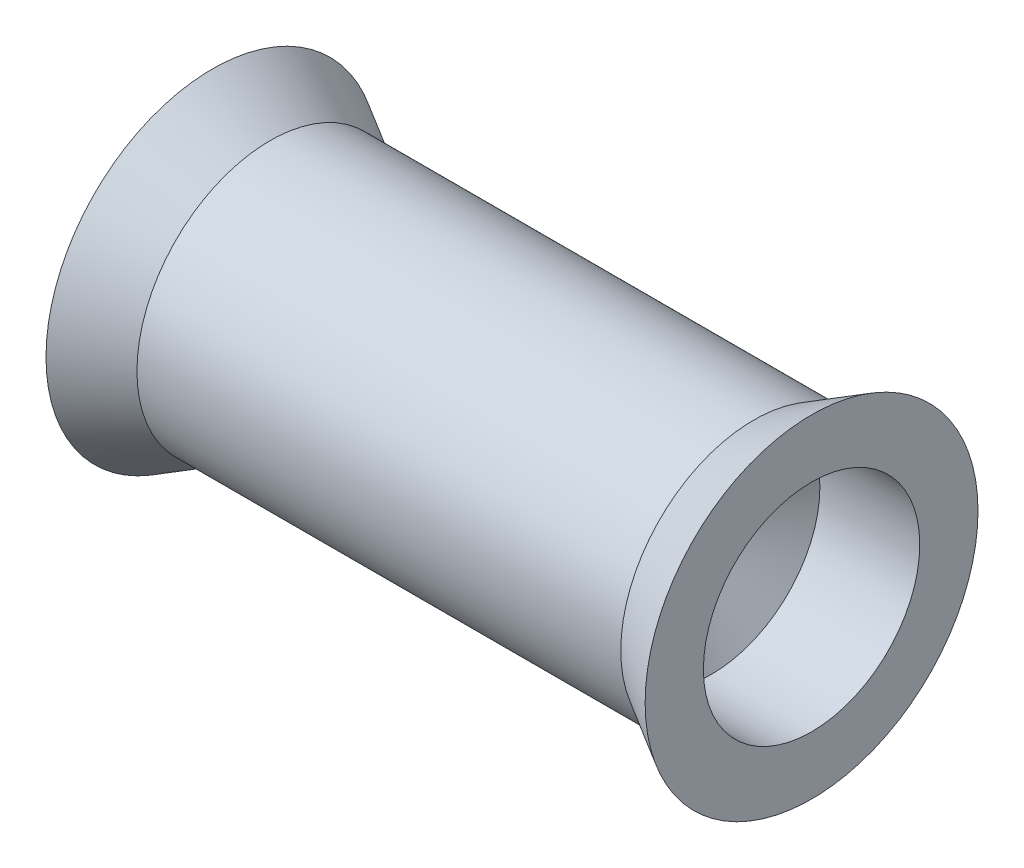
ISO-10303-21;
HEADER;
FILE_DESCRIPTION(('STEP AP214'),'2;1');
FILE_NAME('part.step','',(''),(''),'','','');
FILE_SCHEMA(('AUTOMOTIVE_DESIGN { 1 0 10303 214 1 1 1 1 }'));
ENDSEC;
DATA;
#1=APPLICATION_CONTEXT('core data for automotive mechanical design processes');
#2=APPLICATION_PROTOCOL_DEFINITION('international standard','automotive_design',2000,#1);
#3=PRODUCT_CONTEXT('',#1,'mechanical');
#4=PRODUCT('Part','Part','',(#3));
#5=PRODUCT_RELATED_PRODUCT_CATEGORY('part','',(#4));
#6=PRODUCT_DEFINITION_FORMATION('','',#4);
#7=PRODUCT_DEFINITION_CONTEXT('part definition',#1,'design');
#8=PRODUCT_DEFINITION('design','',#6,#7);
#9=PRODUCT_DEFINITION_SHAPE('','',#8);
#10=(LENGTH_UNIT() NAMED_UNIT(*) SI_UNIT(.MILLI.,.METRE.));
#11=(NAMED_UNIT(*) PLANE_ANGLE_UNIT() SI_UNIT($,.RADIAN.));
#12=(NAMED_UNIT(*) SI_UNIT($,.STERADIAN.) SOLID_ANGLE_UNIT());
#13=UNCERTAINTY_MEASURE_WITH_UNIT(LENGTH_MEASURE(1.E-05),#10,'distance_accuracy_value','');
#14=(GEOMETRIC_REPRESENTATION_CONTEXT(3) GLOBAL_UNCERTAINTY_ASSIGNED_CONTEXT((#13)) GLOBAL_UNIT_ASSIGNED_CONTEXT((#10,
#11,#12)) REPRESENTATION_CONTEXT('',''));
#15=CARTESIAN_POINT('',(0.,0.,0.));
#16=DIRECTION('',(0.,0.,1.));
#17=DIRECTION('',(1.,0.,0.));
#18=AXIS2_PLACEMENT_3D('',#15,#16,#17);
#19=CARTESIAN_POINT('',(-30.,0.,0.));
#20=DIRECTION('',(-1.,0.,0.));
#21=DIRECTION('',(0.,0.,1.));
#22=AXIS2_PLACEMENT_3D('',#19,#20,#21);
#23=CYLINDRICAL_SURFACE('',#22,4.);
#24=CARTESIAN_POINT('',(-7.26794919243113,0.,0.));
#25=DIRECTION('',(-1.,0.,0.));
#26=DIRECTION('',(0.,0.,1.));
#27=AXIS2_PLACEMENT_3D('',#24,#25,#26);
#28=CIRCLE('',#27,4.);
#29=CARTESIAN_POINT('',(-7.26794919243113,0.,4.));
#30=VERTEX_POINT('',#29);
#31=EDGE_CURVE('E54',#30,#30,#28,.T.);
#32=ORIENTED_EDGE('',*,*,#31,.F.);
#33=EDGE_LOOP('',(#32));
#34=FACE_BOUND('',#33,.T.);
#35=CARTESIAN_POINT('',(7.26794919243113,0.,0.));
#36=DIRECTION('',(1.,0.,0.));
#37=DIRECTION('',(0.,0.,-1.));
#38=AXIS2_PLACEMENT_3D('',#35,#36,#37);
#39=CIRCLE('',#38,4.);
#40=CARTESIAN_POINT('',(7.26794919243113,0.,-4.));
#41=VERTEX_POINT('',#40);
#42=EDGE_CURVE('E11',#41,#41,#39,.T.);
#43=ORIENTED_EDGE('',*,*,#42,.F.);
#44=EDGE_LOOP('',(#43));
#45=FACE_BOUND('',#44,.T.);
#46=ADVANCED_FACE('F45',(#34,#45),#23,.T.);
#47=CARTESIAN_POINT('',(-7.26794919243113,0.,0.));
#48=DIRECTION('',(-1.,0.,0.));
#49=DIRECTION('',(0.,0.,1.));
#50=AXIS2_PLACEMENT_3D('',#47,#48,#49);
#51=CONICAL_SURFACE('',#50,4.,0.5235987755983);
#52=CARTESIAN_POINT('',(-9.,0.,0.));
#53=DIRECTION('',(-1.,0.,0.));
#54=DIRECTION('',(0.,0.,1.));
#55=AXIS2_PLACEMENT_3D('',#52,#53,#54);
#56=CIRCLE('',#55,5.);
#57=CARTESIAN_POINT('',(-9.,0.,5.));
#58=VERTEX_POINT('',#57);
#59=EDGE_CURVE('E84',#58,#58,#56,.T.);
#60=ORIENTED_EDGE('',*,*,#59,.F.);
#61=EDGE_LOOP('',(#60));
#62=FACE_BOUND('',#61,.T.);
#63=ORIENTED_EDGE('',*,*,#31,.T.);
#64=EDGE_LOOP('',(#63));
#65=FACE_BOUND('',#64,.T.);
#66=ADVANCED_FACE('F113',(#62,#65),#51,.T.);
#67=CARTESIAN_POINT('',(-9.,0.,0.));
#68=DIRECTION('',(-1.,0.,0.));
#69=DIRECTION('',(0.,0.,1.));
#70=AXIS2_PLACEMENT_3D('',#67,#68,#69);
#71=PLANE('',#70);
#72=CARTESIAN_POINT('',(-9.,0.,0.));
#73=DIRECTION('',(-1.,0.,0.));
#74=DIRECTION('',(0.,0.,1.));
#75=AXIS2_PLACEMENT_3D('',#72,#73,#74);
#76=CIRCLE('',#75,3.25);
#77=CARTESIAN_POINT('',(-9.,0.,3.25));
#78=VERTEX_POINT('',#77);
#79=EDGE_CURVE('E79',#78,#78,#76,.F.);
#80=ORIENTED_EDGE('',*,*,#79,.T.);
#81=EDGE_LOOP('',(#80));
#82=FACE_BOUND('',#81,.T.);
#83=ORIENTED_EDGE('',*,*,#59,.T.);
#84=EDGE_LOOP('',(#83));
#85=FACE_BOUND('',#84,.T.);
#86=ADVANCED_FACE('F94',(#82,#85),#71,.T.);
#87=CARTESIAN_POINT('',(9.,0.,0.));
#88=DIRECTION('',(1.,0.,0.));
#89=DIRECTION('',(0.,0.,-1.));
#90=AXIS2_PLACEMENT_3D('',#87,#88,#89);
#91=CONICAL_SURFACE('',#90,5.,0.5235987755983);
#92=ORIENTED_EDGE('',*,*,#42,.T.);
#93=EDGE_LOOP('',(#92));
#94=FACE_BOUND('',#93,.T.);
#95=CARTESIAN_POINT('',(9.,0.,0.));
#96=DIRECTION('',(-1.,0.,0.));
#97=DIRECTION('',(0.,0.,1.));
#98=AXIS2_PLACEMENT_3D('',#95,#96,#97);
#99=CIRCLE('',#98,5.);
#100=CARTESIAN_POINT('',(9.,0.,5.));
#101=VERTEX_POINT('',#100);
#102=EDGE_CURVE('E80',#101,#101,#99,.T.);
#103=ORIENTED_EDGE('',*,*,#102,.T.);
#104=EDGE_LOOP('',(#103));
#105=FACE_BOUND('',#104,.T.);
#106=ADVANCED_FACE('F124',(#94,#105),#91,.T.);
#107=CARTESIAN_POINT('',(9.,0.,0.));
#108=DIRECTION('',(1.,0.,0.));
#109=DIRECTION('',(0.,0.,-1.));
#110=AXIS2_PLACEMENT_3D('',#107,#108,#109);
#111=PLANE('',#110);
#112=CARTESIAN_POINT('',(9.,0.,0.));
#113=DIRECTION('',(1.,0.,0.));
#114=DIRECTION('',(0.,0.,-1.));
#115=AXIS2_PLACEMENT_3D('',#112,#113,#114);
#116=CIRCLE('',#115,3.25);
#117=CARTESIAN_POINT('',(9.,0.,-3.25));
#118=VERTEX_POINT('',#117);
#119=EDGE_CURVE('E48',#118,#118,#116,.F.);
#120=ORIENTED_EDGE('',*,*,#119,.T.);
#121=EDGE_LOOP('',(#120));
#122=FACE_BOUND('',#121,.T.);
#123=ORIENTED_EDGE('',*,*,#102,.F.);
#124=EDGE_LOOP('',(#123));
#125=FACE_BOUND('',#124,.T.);
#126=ADVANCED_FACE('F101',(#122,#125),#111,.T.);
#127=CARTESIAN_POINT('',(-22.,0.,0.));
#128=DIRECTION('',(-1.,0.,0.));
#129=DIRECTION('',(0.,0.,1.));
#130=AXIS2_PLACEMENT_3D('',#127,#128,#129);
#131=CYLINDRICAL_SURFACE('',#130,3.25);
#132=ORIENTED_EDGE('',*,*,#79,.F.);
#133=EDGE_LOOP('',(#132));
#134=FACE_BOUND('',#133,.T.);
#135=CARTESIAN_POINT('',(-6.,0.,0.));
#136=DIRECTION('',(-1.,0.,0.));
#137=DIRECTION('',(0.,0.,1.));
#138=AXIS2_PLACEMENT_3D('',#135,#136,#137);
#139=CIRCLE('',#138,3.25);
#140=CARTESIAN_POINT('',(-6.,0.,3.25));
#141=VERTEX_POINT('',#140);
#142=EDGE_CURVE('E74',#141,#141,#139,.T.);
#143=ORIENTED_EDGE('',*,*,#142,.F.);
#144=EDGE_LOOP('',(#143));
#145=FACE_BOUND('',#144,.T.);
#146=ADVANCED_FACE('F97',(#134,#145),#131,.F.);
#147=CARTESIAN_POINT('',(-4.12361162513373,0.,0.));
#148=DIRECTION('',(-1.,0.,0.));
#149=DIRECTION('',(0.,0.,1.));
#150=AXIS2_PLACEMENT_3D('',#147,#148,#149);
#151=CONICAL_SURFACE('',#150,0.,1.0471975511966);
#152=ORIENTED_EDGE('',*,*,#142,.T.);
#153=EDGE_LOOP('',(#152));
#154=FACE_BOUND('',#153,.T.);
#155=CARTESIAN_POINT('',(-4.12361162513373,0.,0.));
#156=VERTEX_POINT('',#155);
#157=VERTEX_LOOP('',#156);
#158=FACE_BOUND('',#157,.T.);
#159=ADVANCED_FACE('F100',(#154,#158),#151,.F.);
#160=CARTESIAN_POINT('',(-22.,0.,0.));
#161=DIRECTION('',(-1.,0.,0.));
#162=DIRECTION('',(0.,0.,1.));
#163=AXIS2_PLACEMENT_3D('',#160,#161,#162);
#164=CYLINDRICAL_SURFACE('',#163,3.25);
#165=ORIENTED_EDGE('',*,*,#119,.F.);
#166=EDGE_LOOP('',(#165));
#167=FACE_BOUND('',#166,.T.);
#168=CARTESIAN_POINT('',(6.00000000000001,0.,0.));
#169=DIRECTION('',(-1.,0.,0.));
#170=DIRECTION('',(0.,0.,1.));
#171=AXIS2_PLACEMENT_3D('',#168,#169,#170);
#172=CIRCLE('',#171,3.25);
#173=CARTESIAN_POINT('',(6.00000000000001,0.,3.25));
#174=VERTEX_POINT('',#173);
#175=EDGE_CURVE('E68',#174,#174,#172,.T.);
#176=ORIENTED_EDGE('',*,*,#175,.T.);
#177=EDGE_LOOP('',(#176));
#178=FACE_BOUND('',#177,.T.);
#179=ADVANCED_FACE('F64',(#167,#178),#164,.F.);
#180=CARTESIAN_POINT('',(6.00000000000001,0.,0.));
#181=DIRECTION('',(1.,0.,0.));
#182=DIRECTION('',(0.,0.,-1.));
#183=AXIS2_PLACEMENT_3D('',#180,#181,#182);
#184=CONICAL_SURFACE('',#183,3.25,1.0471975511966);
#185=CARTESIAN_POINT('',(4.12361162513373,0.,0.));
#186=VERTEX_POINT('',#185);
#187=VERTEX_LOOP('',#186);
#188=FACE_BOUND('',#187,.T.);
#189=ORIENTED_EDGE('',*,*,#175,.F.);
#190=EDGE_LOOP('',(#189));
#191=FACE_BOUND('',#190,.T.);
#192=ADVANCED_FACE('F61',(#188,#191),#184,.F.);
#193=CLOSED_SHELL('',(#46,#66,#86,#106,#126,#146,#159,#179,#192));
#194=MANIFOLD_SOLID_BREP('B2',#193);
#195=ADVANCED_BREP_SHAPE_REPRESENTATION('',(#18,#194),#14);
#196=SHAPE_DEFINITION_REPRESENTATION(#9,#195);
ENDSEC;
END-ISO-10303-21;
